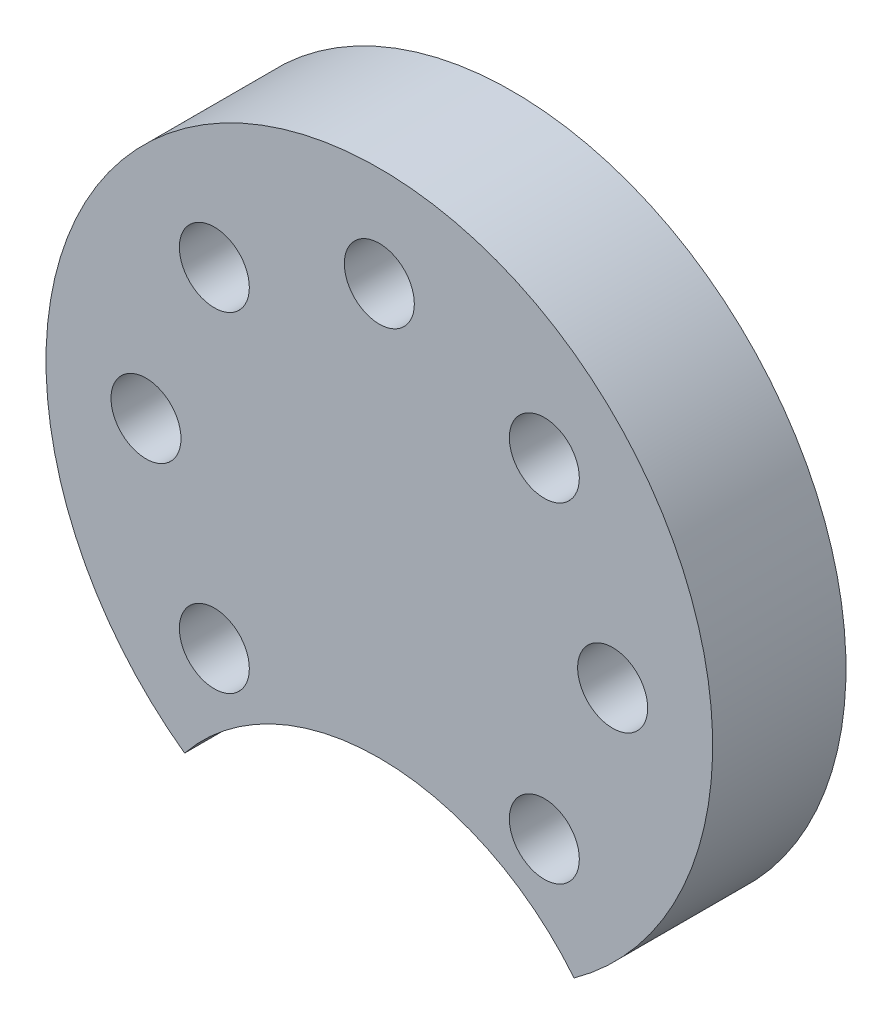
ISO-10303-21;
HEADER;
FILE_DESCRIPTION(('STEP AP214'),'2;1');
FILE_NAME('part.step','',(''),(''),'','','');
FILE_SCHEMA(('AUTOMOTIVE_DESIGN { 1 0 10303 214 1 1 1 1 }'));
ENDSEC;
DATA;
#1=APPLICATION_CONTEXT('core data for automotive mechanical design processes');
#2=APPLICATION_PROTOCOL_DEFINITION('international standard','automotive_design',2000,#1);
#3=PRODUCT_CONTEXT('',#1,'mechanical');
#4=PRODUCT('Part','Part','',(#3));
#5=PRODUCT_RELATED_PRODUCT_CATEGORY('part','',(#4));
#6=PRODUCT_DEFINITION_FORMATION('','',#4);
#7=PRODUCT_DEFINITION_CONTEXT('part definition',#1,'design');
#8=PRODUCT_DEFINITION('design','',#6,#7);
#9=PRODUCT_DEFINITION_SHAPE('','',#8);
#10=(LENGTH_UNIT() NAMED_UNIT(*) SI_UNIT(.MILLI.,.METRE.));
#11=(NAMED_UNIT(*) PLANE_ANGLE_UNIT() SI_UNIT($,.RADIAN.));
#12=(NAMED_UNIT(*) SI_UNIT($,.STERADIAN.) SOLID_ANGLE_UNIT());
#13=UNCERTAINTY_MEASURE_WITH_UNIT(LENGTH_MEASURE(1.E-05),#10,'distance_accuracy_value','');
#14=(GEOMETRIC_REPRESENTATION_CONTEXT(3) GLOBAL_UNCERTAINTY_ASSIGNED_CONTEXT((#13)) GLOBAL_UNIT_ASSIGNED_CONTEXT((#10,
#11,#12)) REPRESENTATION_CONTEXT('',''));
#15=CARTESIAN_POINT('',(0.,0.,0.));
#16=DIRECTION('',(0.,0.,1.));
#17=DIRECTION('',(1.,0.,0.));
#18=AXIS2_PLACEMENT_3D('',#15,#16,#17);
#19=CARTESIAN_POINT('',(-7.,0.,-4.));
#20=DIRECTION('',(0.,0.,1.));
#21=DIRECTION('',(1.,0.,0.));
#22=AXIS2_PLACEMENT_3D('',#19,#20,#21);
#23=CYLINDRICAL_SURFACE('',#22,1.05);
#24=CARTESIAN_POINT('',(-7.,0.,-4.));
#25=DIRECTION('',(0.,0.,1.));
#26=DIRECTION('',(1.,0.,0.));
#27=AXIS2_PLACEMENT_3D('',#24,#25,#26);
#28=CIRCLE('',#27,1.05);
#29=CARTESIAN_POINT('',(-5.95,0.,-4.));
#30=VERTEX_POINT('',#29);
#31=EDGE_CURVE('E71',#30,#30,#28,.T.);
#32=ORIENTED_EDGE('',*,*,#31,.F.);
#33=EDGE_LOOP('',(#32));
#34=FACE_BOUND('',#33,.T.);
#35=CARTESIAN_POINT('',(-7.,0.,0.));
#36=DIRECTION('',(0.,0.,1.));
#37=DIRECTION('',(1.,0.,0.));
#38=AXIS2_PLACEMENT_3D('',#35,#36,#37);
#39=CIRCLE('',#38,1.05);
#40=CARTESIAN_POINT('',(-5.95,0.,0.));
#41=VERTEX_POINT('',#40);
#42=EDGE_CURVE('E96',#41,#41,#39,.T.);
#43=ORIENTED_EDGE('',*,*,#42,.T.);
#44=EDGE_LOOP('',(#43));
#45=FACE_BOUND('',#44,.T.);
#46=ADVANCED_FACE('F35',(#34,#45),#23,.F.);
#47=CARTESIAN_POINT('',(0.,7.,-4.));
#48=DIRECTION('',(0.,0.,1.));
#49=DIRECTION('',(1.,0.,0.));
#50=AXIS2_PLACEMENT_3D('',#47,#48,#49);
#51=CYLINDRICAL_SURFACE('',#50,1.05);
#52=CARTESIAN_POINT('',(0.,7.,-4.));
#53=DIRECTION('',(0.,0.,1.));
#54=DIRECTION('',(1.,0.,0.));
#55=AXIS2_PLACEMENT_3D('',#52,#53,#54);
#56=CIRCLE('',#55,1.05);
#57=CARTESIAN_POINT('',(1.05,7.,-4.));
#58=VERTEX_POINT('',#57);
#59=EDGE_CURVE('E74',#58,#58,#56,.T.);
#60=ORIENTED_EDGE('',*,*,#59,.F.);
#61=EDGE_LOOP('',(#60));
#62=FACE_BOUND('',#61,.T.);
#63=CARTESIAN_POINT('',(0.,7.,0.));
#64=DIRECTION('',(0.,0.,1.));
#65=DIRECTION('',(1.,0.,0.));
#66=AXIS2_PLACEMENT_3D('',#63,#64,#65);
#67=CIRCLE('',#66,1.05);
#68=CARTESIAN_POINT('',(1.05,7.,0.));
#69=VERTEX_POINT('',#68);
#70=EDGE_CURVE('E93',#69,#69,#67,.T.);
#71=ORIENTED_EDGE('',*,*,#70,.T.);
#72=EDGE_LOOP('',(#71));
#73=FACE_BOUND('',#72,.T.);
#74=ADVANCED_FACE('F123',(#62,#73),#51,.F.);
#75=CARTESIAN_POINT('',(7.,0.,-4.));
#76=DIRECTION('',(0.,0.,1.));
#77=DIRECTION('',(1.,0.,0.));
#78=AXIS2_PLACEMENT_3D('',#75,#76,#77);
#79=CYLINDRICAL_SURFACE('',#78,1.05);
#80=CARTESIAN_POINT('',(7.,0.,-4.));
#81=DIRECTION('',(0.,0.,1.));
#82=DIRECTION('',(1.,0.,0.));
#83=AXIS2_PLACEMENT_3D('',#80,#81,#82);
#84=CIRCLE('',#83,1.05);
#85=CARTESIAN_POINT('',(8.05,0.,-4.));
#86=VERTEX_POINT('',#85);
#87=EDGE_CURVE('E116',#86,#86,#84,.T.);
#88=ORIENTED_EDGE('',*,*,#87,.F.);
#89=EDGE_LOOP('',(#88));
#90=FACE_BOUND('',#89,.T.);
#91=CARTESIAN_POINT('',(7.,0.,0.));
#92=DIRECTION('',(0.,0.,1.));
#93=DIRECTION('',(1.,0.,0.));
#94=AXIS2_PLACEMENT_3D('',#91,#92,#93);
#95=CIRCLE('',#94,1.05);
#96=CARTESIAN_POINT('',(8.05,0.,0.));
#97=VERTEX_POINT('',#96);
#98=EDGE_CURVE('E90',#97,#97,#95,.T.);
#99=ORIENTED_EDGE('',*,*,#98,.T.);
#100=EDGE_LOOP('',(#99));
#101=FACE_BOUND('',#100,.T.);
#102=ADVANCED_FACE('F126',(#90,#101),#79,.F.);
#103=CARTESIAN_POINT('',(4.94974746830592,4.94974746830604,-4.));
#104=DIRECTION('',(0.,0.,1.));
#105=DIRECTION('',(1.,0.,0.));
#106=AXIS2_PLACEMENT_3D('',#103,#104,#105);
#107=CYLINDRICAL_SURFACE('',#106,1.05000000000003);
#108=CARTESIAN_POINT('',(4.94974746830592,4.94974746830604,-4.));
#109=DIRECTION('',(0.,0.,1.));
#110=DIRECTION('',(1.,0.,0.));
#111=AXIS2_PLACEMENT_3D('',#108,#109,#110);
#112=CIRCLE('',#111,1.05000000000003);
#113=CARTESIAN_POINT('',(5.99974746830595,4.94974746830604,-4.));
#114=VERTEX_POINT('',#113);
#115=EDGE_CURVE('E113',#114,#114,#112,.T.);
#116=ORIENTED_EDGE('',*,*,#115,.F.);
#117=EDGE_LOOP('',(#116));
#118=FACE_BOUND('',#117,.T.);
#119=CARTESIAN_POINT('',(4.94974746830592,4.94974746830604,0.));
#120=DIRECTION('',(0.,0.,1.));
#121=DIRECTION('',(1.,0.,0.));
#122=AXIS2_PLACEMENT_3D('',#119,#120,#121);
#123=CIRCLE('',#122,1.05000000000003);
#124=CARTESIAN_POINT('',(5.99974746830595,4.94974746830604,0.));
#125=VERTEX_POINT('',#124);
#126=EDGE_CURVE('E87',#125,#125,#123,.T.);
#127=ORIENTED_EDGE('',*,*,#126,.T.);
#128=EDGE_LOOP('',(#127));
#129=FACE_BOUND('',#128,.T.);
#130=ADVANCED_FACE('F146',(#118,#129),#107,.F.);
#131=CARTESIAN_POINT('',(4.94974746830634,-4.94974746830562,-4.));
#132=DIRECTION('',(0.,0.,1.));
#133=DIRECTION('',(1.,0.,0.));
#134=AXIS2_PLACEMENT_3D('',#131,#132,#133);
#135=CYLINDRICAL_SURFACE('',#134,1.05000000000046);
#136=CARTESIAN_POINT('',(4.94974746830634,-4.94974746830562,-4.));
#137=DIRECTION('',(0.,0.,1.));
#138=DIRECTION('',(1.,0.,0.));
#139=AXIS2_PLACEMENT_3D('',#136,#137,#138);
#140=CIRCLE('',#139,1.05000000000046);
#141=CARTESIAN_POINT('',(5.9997474683068,-4.94974746830562,-4.));
#142=VERTEX_POINT('',#141);
#143=EDGE_CURVE('E107',#142,#142,#140,.T.);
#144=ORIENTED_EDGE('',*,*,#143,.F.);
#145=EDGE_LOOP('',(#144));
#146=FACE_BOUND('',#145,.T.);
#147=CARTESIAN_POINT('',(4.94974746830634,-4.94974746830562,0.));
#148=DIRECTION('',(0.,0.,1.));
#149=DIRECTION('',(1.,0.,0.));
#150=AXIS2_PLACEMENT_3D('',#147,#148,#149);
#151=CIRCLE('',#150,1.05000000000046);
#152=CARTESIAN_POINT('',(5.9997474683068,-4.94974746830562,0.));
#153=VERTEX_POINT('',#152);
#154=EDGE_CURVE('E84',#153,#153,#151,.T.);
#155=ORIENTED_EDGE('',*,*,#154,.T.);
#156=EDGE_LOOP('',(#155));
#157=FACE_BOUND('',#156,.T.);
#158=ADVANCED_FACE('F150',(#146,#157),#135,.F.);
#159=CARTESIAN_POINT('',(-4.94974746830533,-4.94974746830604,-4.));
#160=DIRECTION('',(0.,0.,1.));
#161=DIRECTION('',(1.,0.,0.));
#162=AXIS2_PLACEMENT_3D('',#159,#160,#161);
#163=CYLINDRICAL_SURFACE('',#162,1.05000000000061);
#164=CARTESIAN_POINT('',(-4.94974746830533,-4.94974746830604,-4.));
#165=DIRECTION('',(0.,0.,1.));
#166=DIRECTION('',(1.,0.,0.));
#167=AXIS2_PLACEMENT_3D('',#164,#165,#166);
#168=CIRCLE('',#167,1.05000000000061);
#169=CARTESIAN_POINT('',(-3.89974746830472,-4.94974746830604,-4.));
#170=VERTEX_POINT('',#169);
#171=EDGE_CURVE('E102',#170,#170,#168,.T.);
#172=ORIENTED_EDGE('',*,*,#171,.F.);
#173=EDGE_LOOP('',(#172));
#174=FACE_BOUND('',#173,.T.);
#175=CARTESIAN_POINT('',(-4.94974746830533,-4.94974746830604,0.));
#176=DIRECTION('',(0.,0.,1.));
#177=DIRECTION('',(1.,0.,0.));
#178=AXIS2_PLACEMENT_3D('',#175,#176,#177);
#179=CIRCLE('',#178,1.05000000000061);
#180=CARTESIAN_POINT('',(-3.89974746830472,-4.94974746830604,0.));
#181=VERTEX_POINT('',#180);
#182=EDGE_CURVE('E81',#181,#181,#179,.T.);
#183=ORIENTED_EDGE('',*,*,#182,.T.);
#184=EDGE_LOOP('',(#183));
#185=FACE_BOUND('',#184,.T.);
#186=ADVANCED_FACE('F153',(#174,#185),#163,.F.);
#187=CARTESIAN_POINT('',(-4.94974746830575,4.94974746830562,-4.));
#188=DIRECTION('',(0.,0.,1.));
#189=DIRECTION('',(1.,0.,0.));
#190=AXIS2_PLACEMENT_3D('',#187,#188,#189);
#191=CYLINDRICAL_SURFACE('',#190,1.05000000000023);
#192=CARTESIAN_POINT('',(-4.94974746830575,4.94974746830562,-4.));
#193=DIRECTION('',(0.,0.,1.));
#194=DIRECTION('',(1.,0.,0.));
#195=AXIS2_PLACEMENT_3D('',#192,#193,#194);
#196=CIRCLE('',#195,1.05000000000023);
#197=CARTESIAN_POINT('',(-3.89974746830552,4.94974746830562,-4.));
#198=VERTEX_POINT('',#197);
#199=EDGE_CURVE('E99',#198,#198,#196,.T.);
#200=ORIENTED_EDGE('',*,*,#199,.F.);
#201=EDGE_LOOP('',(#200));
#202=FACE_BOUND('',#201,.T.);
#203=CARTESIAN_POINT('',(-4.94974746830575,4.94974746830562,0.));
#204=DIRECTION('',(0.,0.,1.));
#205=DIRECTION('',(1.,0.,0.));
#206=AXIS2_PLACEMENT_3D('',#203,#204,#205);
#207=CIRCLE('',#206,1.05000000000023);
#208=CARTESIAN_POINT('',(-3.89974746830552,4.94974746830562,0.));
#209=VERTEX_POINT('',#208);
#210=EDGE_CURVE('E78',#209,#209,#207,.T.);
#211=ORIENTED_EDGE('',*,*,#210,.T.);
#212=EDGE_LOOP('',(#211));
#213=FACE_BOUND('',#212,.T.);
#214=ADVANCED_FACE('F37',(#202,#213),#191,.F.);
#215=CARTESIAN_POINT('',(0.,0.,-4.));
#216=DIRECTION('',(0.,0.,1.));
#217=DIRECTION('',(1.,0.,0.));
#218=AXIS2_PLACEMENT_3D('',#215,#216,#217);
#219=CYLINDRICAL_SURFACE('',#218,10.);
#220=DIRECTION('',(0.,0.,-1.));
#221=VECTOR('',#220,1.);
#222=CARTESIAN_POINT('',(5.84169307824367,-8.11631825273011,1.));
#223=LINE('',#222,#221);
#224=CARTESIAN_POINT('',(5.84169307824367,-8.11631825273011,-4.));
#225=VERTEX_POINT('',#224);
#226=CARTESIAN_POINT('',(5.84169307824367,-8.11631825273011,0.));
#227=VERTEX_POINT('',#226);
#228=EDGE_CURVE('E49',#225,#227,#223,.F.);
#229=ORIENTED_EDGE('',*,*,#228,.F.);
#230=CARTESIAN_POINT('',(0.,0.,-4.));
#231=DIRECTION('',(0.,0.,1.));
#232=DIRECTION('',(1.,0.,0.));
#233=AXIS2_PLACEMENT_3D('',#230,#231,#232);
#234=CIRCLE('',#233,10.);
#235=CARTESIAN_POINT('',(-5.84169307824368,-8.11631825273011,-4.));
#236=VERTEX_POINT('',#235);
#237=EDGE_CURVE('E43',#225,#236,#234,.T.);
#238=ORIENTED_EDGE('',*,*,#237,.T.);
#239=DIRECTION('',(0.,0.,-1.));
#240=VECTOR('',#239,1.);
#241=CARTESIAN_POINT('',(-5.84169307824368,-8.11631825273011,1.));
#242=LINE('',#241,#240);
#243=CARTESIAN_POINT('',(-5.84169307824368,-8.11631825273011,0.));
#244=VERTEX_POINT('',#243);
#245=EDGE_CURVE('E57',#244,#236,#242,.T.);
#246=ORIENTED_EDGE('',*,*,#245,.F.);
#247=CARTESIAN_POINT('',(0.,0.,0.));
#248=DIRECTION('',(0.,0.,1.));
#249=DIRECTION('',(1.,0.,0.));
#250=AXIS2_PLACEMENT_3D('',#247,#248,#249);
#251=CIRCLE('',#250,10.);
#252=EDGE_CURVE('E98',#227,#244,#251,.T.);
#253=ORIENTED_EDGE('',*,*,#252,.F.);
#254=EDGE_LOOP('',(#229,#238,#246,#253));
#255=FACE_BOUND('',#254,.T.);
#256=ADVANCED_FACE('F70',(#255),#219,.T.);
#257=CARTESIAN_POINT('',(0.,0.,-4.));
#258=DIRECTION('',(0.,0.,1.));
#259=DIRECTION('',(1.,0.,0.));
#260=AXIS2_PLACEMENT_3D('',#257,#258,#259);
#261=PLANE('',#260);
#262=ORIENTED_EDGE('',*,*,#199,.T.);
#263=EDGE_LOOP('',(#262));
#264=FACE_BOUND('',#263,.T.);
#265=ORIENTED_EDGE('',*,*,#171,.T.);
#266=EDGE_LOOP('',(#265));
#267=FACE_BOUND('',#266,.T.);
#268=ORIENTED_EDGE('',*,*,#143,.T.);
#269=EDGE_LOOP('',(#268));
#270=FACE_BOUND('',#269,.T.);
#271=ORIENTED_EDGE('',*,*,#115,.T.);
#272=EDGE_LOOP('',(#271));
#273=FACE_BOUND('',#272,.T.);
#274=ORIENTED_EDGE('',*,*,#87,.T.);
#275=EDGE_LOOP('',(#274));
#276=FACE_BOUND('',#275,.T.);
#277=ORIENTED_EDGE('',*,*,#59,.T.);
#278=EDGE_LOOP('',(#277));
#279=FACE_BOUND('',#278,.T.);
#280=ORIENTED_EDGE('',*,*,#31,.T.);
#281=EDGE_LOOP('',(#280));
#282=FACE_BOUND('',#281,.T.);
#283=ORIENTED_EDGE('',*,*,#237,.F.);
#284=CARTESIAN_POINT('',(0.,-12.82,-4.));
#285=DIRECTION('',(0.,0.,-1.));
#286=DIRECTION('',(-1.,0.,0.));
#287=AXIS2_PLACEMENT_3D('',#284,#285,#286);
#288=CIRCLE('',#287,7.5);
#289=EDGE_CURVE('E60',#236,#225,#288,.T.);
#290=ORIENTED_EDGE('',*,*,#289,.F.);
#291=EDGE_LOOP('',(#283,#290));
#292=FACE_BOUND('',#291,.T.);
#293=ADVANCED_FACE('F68',(#264,#267,#270,#273,#276,#279,#282,#292),#261,.F.);
#294=CARTESIAN_POINT('',(0.,0.,0.));
#295=DIRECTION('',(0.,0.,1.));
#296=DIRECTION('',(1.,0.,0.));
#297=AXIS2_PLACEMENT_3D('',#294,#295,#296);
#298=PLANE('',#297);
#299=CARTESIAN_POINT('',(0.,-12.82,0.));
#300=DIRECTION('',(0.,0.,1.));
#301=DIRECTION('',(1.,0.,0.));
#302=AXIS2_PLACEMENT_3D('',#299,#300,#301);
#303=CIRCLE('',#302,7.5);
#304=EDGE_CURVE('E11',#227,#244,#303,.T.);
#305=ORIENTED_EDGE('',*,*,#304,.F.);
#306=ORIENTED_EDGE('',*,*,#252,.T.);
#307=EDGE_LOOP('',(#305,#306));
#308=FACE_BOUND('',#307,.T.);
#309=ORIENTED_EDGE('',*,*,#210,.F.);
#310=EDGE_LOOP('',(#309));
#311=FACE_BOUND('',#310,.T.);
#312=ORIENTED_EDGE('',*,*,#182,.F.);
#313=EDGE_LOOP('',(#312));
#314=FACE_BOUND('',#313,.T.);
#315=ORIENTED_EDGE('',*,*,#154,.F.);
#316=EDGE_LOOP('',(#315));
#317=FACE_BOUND('',#316,.T.);
#318=ORIENTED_EDGE('',*,*,#126,.F.);
#319=EDGE_LOOP('',(#318));
#320=FACE_BOUND('',#319,.T.);
#321=ORIENTED_EDGE('',*,*,#98,.F.);
#322=EDGE_LOOP('',(#321));
#323=FACE_BOUND('',#322,.T.);
#324=ORIENTED_EDGE('',*,*,#70,.F.);
#325=EDGE_LOOP('',(#324));
#326=FACE_BOUND('',#325,.T.);
#327=ORIENTED_EDGE('',*,*,#42,.F.);
#328=EDGE_LOOP('',(#327));
#329=FACE_BOUND('',#328,.T.);
#330=ADVANCED_FACE('F130',(#308,#311,#314,#317,#320,#323,#326,#329),#298,.T.);
#331=CARTESIAN_POINT('',(0.,-12.82,6.));
#332=DIRECTION('',(0.,0.,-1.));
#333=DIRECTION('',(-1.,0.,0.));
#334=AXIS2_PLACEMENT_3D('',#331,#332,#333);
#335=CYLINDRICAL_SURFACE('',#334,7.5);
#336=ORIENTED_EDGE('',*,*,#228,.T.);
#337=ORIENTED_EDGE('',*,*,#304,.T.);
#338=ORIENTED_EDGE('',*,*,#245,.T.);
#339=ORIENTED_EDGE('',*,*,#289,.T.);
#340=EDGE_LOOP('',(#336,#337,#338,#339));
#341=FACE_BOUND('',#340,.T.);
#342=ADVANCED_FACE('F59',(#341),#335,.F.);
#343=CLOSED_SHELL('',(#46,#74,#102,#130,#158,#186,#214,#256,#293,#330,#342));
#344=MANIFOLD_SOLID_BREP('B2',#343);
#345=ADVANCED_BREP_SHAPE_REPRESENTATION('',(#18,#344),#14);
#346=SHAPE_DEFINITION_REPRESENTATION(#9,#345);
ENDSEC;
END-ISO-10303-21;
